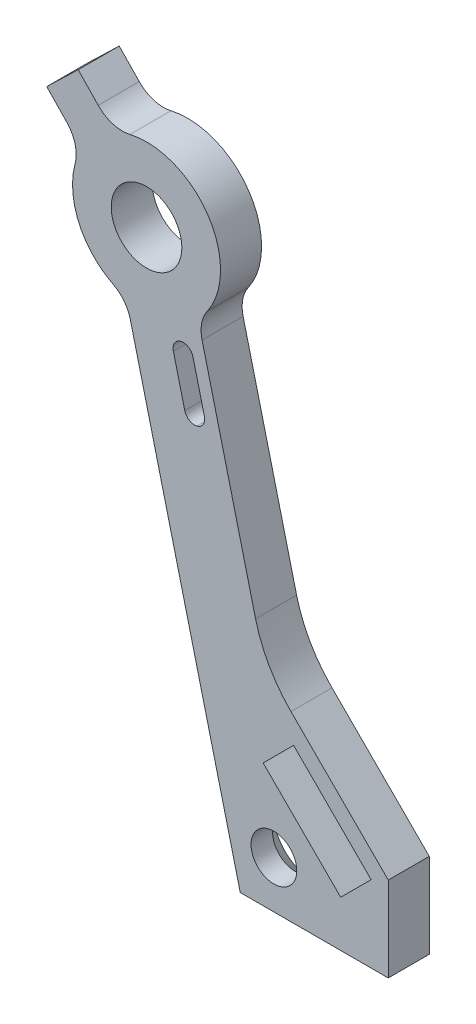
ISO-10303-21;
HEADER;
FILE_DESCRIPTION(('STEP AP214'),'2;1');
FILE_NAME('part.step','',(''),(''),'','','');
FILE_SCHEMA(('AUTOMOTIVE_DESIGN { 1 0 10303 214 1 1 1 1 }'));
ENDSEC;
DATA;
#1=APPLICATION_CONTEXT('core data for automotive mechanical design processes');
#2=APPLICATION_PROTOCOL_DEFINITION('international standard','automotive_design',2000,#1);
#3=PRODUCT_CONTEXT('',#1,'mechanical');
#4=PRODUCT('Part','Part','',(#3));
#5=PRODUCT_RELATED_PRODUCT_CATEGORY('part','',(#4));
#6=PRODUCT_DEFINITION_FORMATION('','',#4);
#7=PRODUCT_DEFINITION_CONTEXT('part definition',#1,'design');
#8=PRODUCT_DEFINITION('design','',#6,#7);
#9=PRODUCT_DEFINITION_SHAPE('','',#8);
#10=(LENGTH_UNIT() NAMED_UNIT(*) SI_UNIT(.MILLI.,.METRE.));
#11=(NAMED_UNIT(*) PLANE_ANGLE_UNIT() SI_UNIT($,.RADIAN.));
#12=(NAMED_UNIT(*) SI_UNIT($,.STERADIAN.) SOLID_ANGLE_UNIT());
#13=UNCERTAINTY_MEASURE_WITH_UNIT(LENGTH_MEASURE(1.E-05),#10,'distance_accuracy_value','');
#14=(GEOMETRIC_REPRESENTATION_CONTEXT(3) GLOBAL_UNCERTAINTY_ASSIGNED_CONTEXT((#13)) GLOBAL_UNIT_ASSIGNED_CONTEXT((#10,
#11,#12)) REPRESENTATION_CONTEXT('',''));
#15=CARTESIAN_POINT('',(0.,0.,0.));
#16=DIRECTION('',(0.,0.,1.));
#17=DIRECTION('',(1.,0.,0.));
#18=AXIS2_PLACEMENT_3D('',#15,#16,#17);
#19=CARTESIAN_POINT('',(4.36654034065617,1.08780763622181,-3.05));
#20=DIRECTION('',(-0.970342297923589,-0.241735030271512,0.));
#21=DIRECTION('',(0.241735030271512,-0.970342297923589,0.));
#22=AXIS2_PLACEMENT_3D('',#19,#20,#21);
#23=PLANE('',#22);
#24=DIRECTION('',(-0.241735030271512,0.970342297923589,0.));
#25=VECTOR('',#24,1.);
#26=CARTESIAN_POINT('',(4.36654034065617,1.08780763622181,0.));
#27=LINE('',#26,#25);
#28=CARTESIAN_POINT('',(-2.66788839228542,29.3245250604018,0.));
#29=VERTEX_POINT('',#28);
#30=CARTESIAN_POINT('',(-3.51396099823572,32.7207231031344,0.));
#31=VERTEX_POINT('',#30);
#32=EDGE_CURVE('E313',#29,#31,#27,.T.);
#33=ORIENTED_EDGE('',*,*,#32,.T.);
#34=DIRECTION('',(0.,0.,1.));
#35=VECTOR('',#34,1.);
#36=CARTESIAN_POINT('',(-3.51396099823572,32.7207231031344,0.));
#37=LINE('',#36,#35);
#38=CARTESIAN_POINT('',(-3.51396099823572,32.7207231031344,-3.05));
#39=VERTEX_POINT('',#38);
#40=EDGE_CURVE('E387',#39,#31,#37,.T.);
#41=ORIENTED_EDGE('',*,*,#40,.F.);
#42=DIRECTION('',(-0.241735030271512,0.970342297923589,0.));
#43=VECTOR('',#42,1.);
#44=CARTESIAN_POINT('',(4.36654034065617,1.08780763622181,-3.05));
#45=LINE('',#44,#43);
#46=CARTESIAN_POINT('',(-2.66788839228542,29.3245250604018,-3.05));
#47=VERTEX_POINT('',#46);
#48=EDGE_CURVE('E269',#47,#39,#45,.T.);
#49=ORIENTED_EDGE('',*,*,#48,.F.);
#50=DIRECTION('',(0.,0.,1.));
#51=VECTOR('',#50,1.);
#52=CARTESIAN_POINT('',(-2.66788839228542,29.3245250604018,-3.05));
#53=LINE('',#52,#51);
#54=EDGE_CURVE('E390',#29,#47,#53,.F.);
#55=ORIENTED_EDGE('',*,*,#54,.F.);
#56=EDGE_LOOP('',(#33,#41,#49,#55));
#57=FACE_BOUND('',#56,.T.);
#58=ADVANCED_FACE('F45',(#57),#23,.T.);
#59=CARTESIAN_POINT('',(7.70970869120796,7.70970869120796,-3.05));
#60=DIRECTION('',(0.707106781186548,0.707106781186547,0.));
#61=DIRECTION('',(-0.707106781186547,0.707106781186548,0.));
#62=AXIS2_PLACEMENT_3D('',#59,#60,#61);
#63=PLANE('',#62);
#64=DIRECTION('',(0.707106781186547,-0.707106781186548,0.));
#65=VECTOR('',#64,1.);
#66=CARTESIAN_POINT('',(7.70970869120796,7.70970869120796,0.));
#67=LINE('',#66,#65);
#68=CARTESIAN_POINT('',(3.96428752719385,11.4551298552221,0.));
#69=VERTEX_POINT('',#68);
#70=CARTESIAN_POINT('',(9.72720779386421,5.6922095885517,0.));
#71=VERTEX_POINT('',#70);
#72=EDGE_CURVE('E303',#69,#71,#67,.T.);
#73=ORIENTED_EDGE('',*,*,#72,.F.);
#74=DIRECTION('',(0.,0.,1.));
#75=VECTOR('',#74,1.);
#76=CARTESIAN_POINT('',(3.96428752719385,11.4551298552221,-3.05));
#77=LINE('',#76,#75);
#78=CARTESIAN_POINT('',(3.96428752719385,11.4551298552221,-3.05));
#79=VERTEX_POINT('',#78);
#80=EDGE_CURVE('E231',#79,#69,#77,.T.);
#81=ORIENTED_EDGE('',*,*,#80,.F.);
#82=DIRECTION('',(0.707106781186547,-0.707106781186548,0.));
#83=VECTOR('',#82,1.);
#84=CARTESIAN_POINT('',(7.70970869120796,7.70970869120796,-3.05));
#85=LINE('',#84,#83);
#86=CARTESIAN_POINT('',(9.72720779386421,5.6922095885517,-3.05));
#87=VERTEX_POINT('',#86);
#88=EDGE_CURVE('E259',#79,#87,#85,.T.);
#89=ORIENTED_EDGE('',*,*,#88,.T.);
#90=DIRECTION('',(0.,0.,1.));
#91=VECTOR('',#90,1.);
#92=CARTESIAN_POINT('',(9.72720779386421,5.6922095885517,-3.05));
#93=LINE('',#92,#91);
#94=EDGE_CURVE('E327',#87,#71,#93,.T.);
#95=ORIENTED_EDGE('',*,*,#94,.T.);
#96=EDGE_LOOP('',(#73,#81,#89,#95));
#97=FACE_BOUND('',#96,.T.);
#98=ADVANCED_FACE('F475',(#97),#63,.F.);
#99=CARTESIAN_POINT('',(2.01749910265625,-2.01749910265625,-3.05));
#100=DIRECTION('',(-0.707106781186547,0.707106781186548,0.));
#101=DIRECTION('',(-0.707106781186548,-0.707106781186547,0.));
#102=AXIS2_PLACEMENT_3D('',#99,#100,#101);
#103=PLANE('',#102);
#104=DIRECTION('',(0.707106781186548,0.707106781186547,0.));
#105=VECTOR('',#104,1.);
#106=CARTESIAN_POINT('',(2.01749910265625,-2.01749910265625,0.));
#107=LINE('',#106,#105);
#108=CARTESIAN_POINT('',(7.46446609406726,3.42946788875475,0.));
#109=VERTEX_POINT('',#108);
#110=EDGE_CURVE('E306',#109,#71,#107,.T.);
#111=ORIENTED_EDGE('',*,*,#110,.T.);
#112=ORIENTED_EDGE('',*,*,#94,.F.);
#113=DIRECTION('',(0.707106781186548,0.707106781186547,0.));
#114=VECTOR('',#113,1.);
#115=CARTESIAN_POINT('',(2.01749910265625,-2.01749910265625,-3.05));
#116=LINE('',#115,#114);
#117=CARTESIAN_POINT('',(7.46446609406726,3.42946788875475,-3.05));
#118=VERTEX_POINT('',#117);
#119=EDGE_CURVE('E262',#118,#87,#116,.T.);
#120=ORIENTED_EDGE('',*,*,#119,.F.);
#121=DIRECTION('',(0.,0.,1.));
#122=VECTOR('',#121,1.);
#123=CARTESIAN_POINT('',(7.46446609406726,3.42946788875475,-3.05));
#124=LINE('',#123,#122);
#125=EDGE_CURVE('E324',#118,#109,#124,.T.);
#126=ORIENTED_EDGE('',*,*,#125,.T.);
#127=EDGE_LOOP('',(#111,#112,#120,#126));
#128=FACE_BOUND('',#127,.T.);
#129=ADVANCED_FACE('F480',(#128),#103,.T.);
#130=CARTESIAN_POINT('',(5.44696699141101,5.44696699141101,-3.05));
#131=DIRECTION('',(-0.707106781186548,-0.707106781186548,0.));
#132=DIRECTION('',(0.707106781186548,-0.707106781186548,0.));
#133=AXIS2_PLACEMENT_3D('',#130,#131,#132);
#134=PLANE('',#133);
#135=DIRECTION('',(-0.707106781186548,0.707106781186548,0.));
#136=VECTOR('',#135,1.);
#137=CARTESIAN_POINT('',(5.44696699141101,5.44696699141101,0.));
#138=LINE('',#137,#136);
#139=CARTESIAN_POINT('',(1.70154582739689,9.19238815542512,0.));
#140=VERTEX_POINT('',#139);
#141=EDGE_CURVE('E308',#109,#140,#138,.T.);
#142=ORIENTED_EDGE('',*,*,#141,.F.);
#143=ORIENTED_EDGE('',*,*,#125,.F.);
#144=DIRECTION('',(-0.707106781186548,0.707106781186548,0.));
#145=VECTOR('',#144,1.);
#146=CARTESIAN_POINT('',(5.44696699141101,5.44696699141101,-3.05));
#147=LINE('',#146,#145);
#148=CARTESIAN_POINT('',(1.70154582739689,9.19238815542512,-3.05));
#149=VERTEX_POINT('',#148);
#150=EDGE_CURVE('E264',#118,#149,#147,.T.);
#151=ORIENTED_EDGE('',*,*,#150,.T.);
#152=DIRECTION('',(0.,0.,1.));
#153=VECTOR('',#152,1.);
#154=CARTESIAN_POINT('',(1.70154582739689,9.19238815542512,-3.05));
#155=LINE('',#154,#153);
#156=EDGE_CURVE('E321',#149,#140,#155,.T.);
#157=ORIENTED_EDGE('',*,*,#156,.T.);
#158=EDGE_LOOP('',(#142,#143,#151,#157));
#159=FACE_BOUND('',#158,.T.);
#160=ADVANCED_FACE('F489',(#159),#134,.F.);
#161=CARTESIAN_POINT('',(-6.96463898907044,39.3326684601052,-3.05));
#162=DIRECTION('',(0.,0.,1.));
#163=DIRECTION('',(-1.,0.,0.));
#164=AXIS2_PLACEMENT_3D('',#161,#162,#163);
#165=CYLINDRICAL_SURFACE('',#164,5.5);
#166=CARTESIAN_POINT('',(-6.96463898907044,39.3326684601052,0.));
#167=DIRECTION('',(0.,0.,1.));
#168=DIRECTION('',(1.,0.,0.));
#169=AXIS2_PLACEMENT_3D('',#166,#167,#168);
#170=CIRCLE('',#169,5.5);
#171=CARTESIAN_POINT('',(-2.45911194166731,36.1782705738013,0.));
#172=VERTEX_POINT('',#171);
#173=CARTESIAN_POINT('',(-8.19716703361366,44.6927873598513,0.));
#174=VERTEX_POINT('',#173);
#175=EDGE_CURVE('E279',#172,#174,#170,.T.);
#176=ORIENTED_EDGE('',*,*,#175,.F.);
#177=DIRECTION('',(0.,0.,1.));
#178=VECTOR('',#177,1.);
#179=CARTESIAN_POINT('',(-2.45911194166731,36.1782705738013,-3.05));
#180=LINE('',#179,#178);
#181=CARTESIAN_POINT('',(-2.45911194166731,36.1782705738013,-3.05));
#182=VERTEX_POINT('',#181);
#183=EDGE_CURVE('E340',#182,#172,#180,.T.);
#184=ORIENTED_EDGE('',*,*,#183,.F.);
#185=CARTESIAN_POINT('',(-6.96463898907044,39.3326684601052,-3.05));
#186=DIRECTION('',(0.,0.,1.));
#187=DIRECTION('',(1.,0.,0.));
#188=AXIS2_PLACEMENT_3D('',#185,#186,#187);
#189=CIRCLE('',#188,5.5);
#190=CARTESIAN_POINT('',(-8.19716703361366,44.6927873598513,-3.05));
#191=VERTEX_POINT('',#190);
#192=EDGE_CURVE('E238',#182,#191,#189,.T.);
#193=ORIENTED_EDGE('',*,*,#192,.T.);
#194=DIRECTION('',(0.,0.,1.));
#195=VECTOR('',#194,1.);
#196=CARTESIAN_POINT('',(-8.19716703361366,44.6927873598513,-3.05));
#197=LINE('',#196,#195);
#198=EDGE_CURVE('E343',#174,#191,#197,.F.);
#199=ORIENTED_EDGE('',*,*,#198,.F.);
#200=EDGE_LOOP('',(#176,#184,#193,#199));
#201=FACE_BOUND('',#200,.T.);
#202=ADVANCED_FACE('F492',(#201),#165,.T.);
#203=CARTESIAN_POINT('',(17.2180416361221,16.6208626165362,-3.05));
#204=DIRECTION('',(0.719473565232645,0.694519826161519,0.));
#205=DIRECTION('',(-0.694519826161519,0.719473565232645,0.));
#206=AXIS2_PLACEMENT_3D('',#203,#204,#205);
#207=PLANE('',#206);
#208=DIRECTION('',(0.694519826161519,-0.719473565232645,0.));
#209=VECTOR('',#208,1.);
#210=CARTESIAN_POINT('',(17.2180416361221,16.6208626165362,-3.05));
#211=LINE('',#210,#209);
#212=CARTESIAN_POINT('',(-12.0461728810211,46.9365252647115,-3.05));
#213=VERTEX_POINT('',#212);
#214=CARTESIAN_POINT('',(-10.5560909669422,45.3929054761502,-3.05));
#215=VERTEX_POINT('',#214);
#216=EDGE_CURVE('E216',#213,#215,#211,.T.);
#217=ORIENTED_EDGE('',*,*,#216,.F.);
#218=DIRECTION('',(0.,0.,1.));
#219=VECTOR('',#218,1.);
#220=CARTESIAN_POINT('',(-12.0461728810211,46.9365252647115,-3.05));
#221=LINE('',#220,#219);
#222=CARTESIAN_POINT('',(-12.0461728810211,46.9365252647115,0.));
#223=VERTEX_POINT('',#222);
#224=EDGE_CURVE('E224',#213,#223,#221,.T.);
#225=ORIENTED_EDGE('',*,*,#224,.T.);
#226=DIRECTION('',(0.694519826161519,-0.719473565232645,0.));
#227=VECTOR('',#226,1.);
#228=CARTESIAN_POINT('',(17.2180416361221,16.6208626165362,0.));
#229=LINE('',#228,#227);
#230=CARTESIAN_POINT('',(-10.5560909669422,45.3929054761502,0.));
#231=VERTEX_POINT('',#230);
#232=EDGE_CURVE('E286',#223,#231,#229,.T.);
#233=ORIENTED_EDGE('',*,*,#232,.T.);
#234=DIRECTION('',(0.,0.,1.));
#235=VECTOR('',#234,1.);
#236=CARTESIAN_POINT('',(-10.5560909669422,45.3929054761502,-3.05));
#237=LINE('',#236,#235);
#238=EDGE_CURVE('E237',#215,#231,#237,.T.);
#239=ORIENTED_EDGE('',*,*,#238,.F.);
#240=EDGE_LOOP('',(#217,#225,#233,#239));
#241=FACE_BOUND('',#240,.T.);
#242=ADVANCED_FACE('F235',(#241),#207,.T.);
#243=CARTESIAN_POINT('',(-29.2642145171432,30.3156626481751,-3.05));
#244=DIRECTION('',(-0.694519826161522,0.719473565232643,0.));
#245=DIRECTION('',(-0.719473565232643,-0.694519826161522,0.));
#246=AXIS2_PLACEMENT_3D('',#243,#244,#245);
#247=PLANE('',#246);
#248=DIRECTION('',(0.719473565232643,0.694519826161522,0.));
#249=VECTOR('',#248,1.);
#250=CARTESIAN_POINT('',(-29.2642145171432,30.3156626481751,0.));
#251=LINE('',#250,#249);
#252=CARTESIAN_POINT('',(-14.3844619680272,44.6793358296865,0.));
#253=VERTEX_POINT('',#252);
#254=EDGE_CURVE('E227',#253,#223,#251,.T.);
#255=ORIENTED_EDGE('',*,*,#254,.T.);
#256=ORIENTED_EDGE('',*,*,#224,.F.);
#257=DIRECTION('',(0.719473565232643,0.694519826161522,0.));
#258=VECTOR('',#257,1.);
#259=CARTESIAN_POINT('',(-29.2642145171432,30.3156626481751,-3.05));
#260=LINE('',#259,#258);
#261=CARTESIAN_POINT('',(-14.3844619680272,44.6793358296865,-3.05));
#262=VERTEX_POINT('',#261);
#263=EDGE_CURVE('E210',#262,#213,#260,.T.);
#264=ORIENTED_EDGE('',*,*,#263,.F.);
#265=DIRECTION('',(0.,0.,1.));
#266=VECTOR('',#265,1.);
#267=CARTESIAN_POINT('',(-14.3844619680272,44.6793358296865,-3.05));
#268=LINE('',#267,#266);
#269=EDGE_CURVE('E232',#262,#253,#268,.T.);
#270=ORIENTED_EDGE('',*,*,#269,.T.);
#271=EDGE_LOOP('',(#255,#256,#264,#270));
#272=FACE_BOUND('',#271,.T.);
#273=ADVANCED_FACE('F225',(#272),#247,.T.);
#274=CARTESIAN_POINT('',(14.8797525491159,14.3636731815112,-3.05));
#275=DIRECTION('',(0.719473565232646,0.694519826161518,0.));
#276=DIRECTION('',(-0.694519826161518,0.719473565232646,0.));
#277=AXIS2_PLACEMENT_3D('',#274,#275,#276);
#278=PLANE('',#277);
#279=DIRECTION('',(0.694519826161518,-0.719473565232647,0.));
#280=VECTOR('',#279,1.);
#281=CARTESIAN_POINT('',(14.8797525491159,14.3636731815112,0.));
#282=LINE('',#281,#280);
#283=CARTESIAN_POINT('',(-12.8943800539482,43.1357160411252,0.));
#284=VERTEX_POINT('',#283);
#285=EDGE_CURVE('E285',#253,#284,#282,.T.);
#286=ORIENTED_EDGE('',*,*,#285,.F.);
#287=ORIENTED_EDGE('',*,*,#269,.F.);
#288=DIRECTION('',(0.694519826161518,-0.719473565232647,0.));
#289=VECTOR('',#288,1.);
#290=CARTESIAN_POINT('',(14.8797525491159,14.3636731815112,-3.05));
#291=LINE('',#290,#289);
#292=CARTESIAN_POINT('',(-12.8943800539482,43.1357160411252,-3.05));
#293=VERTEX_POINT('',#292);
#294=EDGE_CURVE('E218',#262,#293,#291,.T.);
#295=ORIENTED_EDGE('',*,*,#294,.T.);
#296=DIRECTION('',(0.,0.,-1.));
#297=VECTOR('',#296,1.);
#298=CARTESIAN_POINT('',(-12.8943800539482,43.1357160411252,-3.05));
#299=LINE('',#298,#297);
#300=EDGE_CURVE('E352',#284,#293,#299,.T.);
#301=ORIENTED_EDGE('',*,*,#300,.F.);
#302=EDGE_LOOP('',(#286,#287,#295,#301));
#303=FACE_BOUND('',#302,.T.);
#304=ADVANCED_FACE('F518',(#303),#278,.F.);
#305=CARTESIAN_POINT('',(-12.2779311614175,40.7535577208413,-3.05));
#306=VERTEX_POINT('',#305);
#307=CARTESIAN_POINT('',(-9.4637704048032,34.4332458240289,-3.05));
#308=VERTEX_POINT('',#307);
#309=EDGE_CURVE('E243',#306,#308,#189,.T.);
#310=ORIENTED_EDGE('',*,*,#309,.T.);
#311=DIRECTION('',(0.,0.,1.));
#312=VECTOR('',#311,1.);
#313=CARTESIAN_POINT('',(-9.4637704048032,34.4332458240289,-3.05));
#314=LINE('',#313,#312);
#315=CARTESIAN_POINT('',(-9.4637704048032,34.4332458240289,0.));
#316=VERTEX_POINT('',#315);
#317=EDGE_CURVE('E346',#316,#308,#314,.F.);
#318=ORIENTED_EDGE('',*,*,#317,.F.);
#319=CARTESIAN_POINT('',(-12.2779311614175,40.7535577208413,0.));
#320=VERTEX_POINT('',#319);
#321=EDGE_CURVE('E281',#320,#316,#170,.T.);
#322=ORIENTED_EDGE('',*,*,#321,.F.);
#323=DIRECTION('',(0.,0.,1.));
#324=VECTOR('',#323,1.);
#325=CARTESIAN_POINT('',(-12.2779311614175,40.7535577208413,-3.05));
#326=LINE('',#325,#324);
#327=EDGE_CURVE('E349',#306,#320,#326,.T.);
#328=ORIENTED_EDGE('',*,*,#327,.F.);
#329=EDGE_LOOP('',(#310,#318,#322,#328));
#330=FACE_BOUND('',#329,.T.);
#331=ADVANCED_FACE('F514',(#330),#165,.T.);
#332=CARTESIAN_POINT('',(0.,0.,-3.05));
#333=DIRECTION('',(-0.970342297923589,-0.241735030271511,0.));
#334=DIRECTION('',(0.241735030271511,-0.970342297923589,0.));
#335=AXIS2_PLACEMENT_3D('',#332,#333,#334);
#336=PLANE('',#335);
#337=DIRECTION('',(-0.241735030271511,0.970342297923589,0.));
#338=VECTOR('',#337,1.);
#339=CARTESIAN_POINT('',(0.,0.,-3.05));
#340=LINE('',#339,#338);
#341=CARTESIAN_POINT('',(0.,0.,-3.05));
#342=VERTEX_POINT('',#341);
#343=CARTESIAN_POINT('',(-8.17388348532729,32.810573110582,-3.05));
#344=VERTEX_POINT('',#343);
#345=EDGE_CURVE('E247',#342,#344,#340,.T.);
#346=ORIENTED_EDGE('',*,*,#345,.F.);
#347=DIRECTION('',(0.,0.,1.));
#348=VECTOR('',#347,1.);
#349=CARTESIAN_POINT('',(0.,0.,-3.05));
#350=LINE('',#349,#348);
#351=CARTESIAN_POINT('',(0.,0.,0.));
#352=VERTEX_POINT('',#351);
#353=EDGE_CURVE('E335',#342,#352,#350,.T.);
#354=ORIENTED_EDGE('',*,*,#353,.T.);
#355=DIRECTION('',(-0.241735030271511,0.970342297923589,0.));
#356=VECTOR('',#355,1.);
#357=CARTESIAN_POINT('',(0.,0.,0.));
#358=LINE('',#357,#356);
#359=CARTESIAN_POINT('',(-8.17388348532729,32.810573110582,0.));
#360=VERTEX_POINT('',#359);
#361=EDGE_CURVE('E284',#352,#360,#358,.T.);
#362=ORIENTED_EDGE('',*,*,#361,.T.);
#363=DIRECTION('',(0.,0.,1.));
#364=VECTOR('',#363,1.);
#365=CARTESIAN_POINT('',(-8.17388348532729,32.810573110582,-3.05));
#366=LINE('',#365,#364);
#367=EDGE_CURVE('E355',#344,#360,#366,.T.);
#368=ORIENTED_EDGE('',*,*,#367,.F.);
#369=EDGE_LOOP('',(#346,#354,#362,#368));
#370=FACE_BOUND('',#369,.T.);
#371=ADVANCED_FACE('F510',(#370),#336,.T.);
#372=CARTESIAN_POINT('',(0.,0.,-3.05));
#373=DIRECTION('',(0.,1.,0.));
#374=DIRECTION('',(-1.,0.,0.));
#375=AXIS2_PLACEMENT_3D('',#372,#373,#374);
#376=PLANE('',#375);
#377=DIRECTION('',(1.,0.,0.));
#378=VECTOR('',#377,1.);
#379=CARTESIAN_POINT('',(0.,0.,0.));
#380=LINE('',#379,#378);
#381=CARTESIAN_POINT('',(11.,0.,0.));
#382=VERTEX_POINT('',#381);
#383=EDGE_CURVE('E293',#352,#382,#380,.T.);
#384=ORIENTED_EDGE('',*,*,#383,.F.);
#385=ORIENTED_EDGE('',*,*,#353,.F.);
#386=DIRECTION('',(1.,0.,0.));
#387=VECTOR('',#386,1.);
#388=CARTESIAN_POINT('',(0.,0.,-3.05));
#389=LINE('',#388,#387);
#390=CARTESIAN_POINT('',(11.,0.,-3.05));
#391=VERTEX_POINT('',#390);
#392=EDGE_CURVE('E250',#342,#391,#389,.T.);
#393=ORIENTED_EDGE('',*,*,#392,.T.);
#394=DIRECTION('',(0.,0.,1.));
#395=VECTOR('',#394,1.);
#396=CARTESIAN_POINT('',(11.,0.,-3.05));
#397=LINE('',#396,#395);
#398=EDGE_CURVE('E332',#391,#382,#397,.T.);
#399=ORIENTED_EDGE('',*,*,#398,.T.);
#400=EDGE_LOOP('',(#384,#385,#393,#399));
#401=FACE_BOUND('',#400,.T.);
#402=ADVANCED_FACE('F506',(#401),#376,.F.);
#403=CARTESIAN_POINT('',(11.,0.,-3.05));
#404=DIRECTION('',(1.,0.,0.));
#405=DIRECTION('',(0.,0.,1.));
#406=AXIS2_PLACEMENT_3D('',#403,#404,#405);
#407=PLANE('',#406);
#408=DIRECTION('',(0.,-1.,0.));
#409=VECTOR('',#408,1.);
#410=CARTESIAN_POINT('',(11.,0.,0.));
#411=LINE('',#410,#409);
#412=CARTESIAN_POINT('',(11.,6.30390861535611,0.));
#413=VERTEX_POINT('',#412);
#414=EDGE_CURVE('E296',#413,#382,#411,.T.);
#415=ORIENTED_EDGE('',*,*,#414,.T.);
#416=ORIENTED_EDGE('',*,*,#398,.F.);
#417=DIRECTION('',(0.,-1.,0.));
#418=VECTOR('',#417,1.);
#419=CARTESIAN_POINT('',(11.,0.,-3.05));
#420=LINE('',#419,#418);
#421=CARTESIAN_POINT('',(11.,6.30390861535611,-3.05));
#422=VERTEX_POINT('',#421);
#423=EDGE_CURVE('E253',#422,#391,#420,.T.);
#424=ORIENTED_EDGE('',*,*,#423,.F.);
#425=DIRECTION('',(0.,0.,1.));
#426=VECTOR('',#425,1.);
#427=CARTESIAN_POINT('',(11.,6.30390861535611,-3.05));
#428=LINE('',#427,#426);
#429=EDGE_CURVE('E275',#422,#413,#428,.T.);
#430=ORIENTED_EDGE('',*,*,#429,.T.);
#431=EDGE_LOOP('',(#415,#416,#424,#430));
#432=FACE_BOUND('',#431,.T.);
#433=ADVANCED_FACE('F502',(#432),#407,.T.);
#434=CARTESIAN_POINT('',(8.65195430767805,8.65195430767805,-3.05));
#435=DIRECTION('',(0.707106781186547,0.707106781186548,0.));
#436=DIRECTION('',(-0.707106781186548,0.707106781186547,0.));
#437=AXIS2_PLACEMENT_3D('',#434,#435,#436);
#438=PLANE('',#437);
#439=DIRECTION('',(0.707106781186548,-0.707106781186547,0.));
#440=VECTOR('',#439,1.);
#441=CARTESIAN_POINT('',(8.65195430767805,8.65195430767805,0.));
#442=LINE('',#441,#440);
#443=CARTESIAN_POINT('',(3.76932576449459,13.5345828508615,0.));
#444=VERTEX_POINT('',#443);
#445=EDGE_CURVE('E298',#444,#413,#442,.T.);
#446=ORIENTED_EDGE('',*,*,#445,.T.);
#447=ORIENTED_EDGE('',*,*,#429,.F.);
#448=DIRECTION('',(0.707106781186548,-0.707106781186547,0.));
#449=VECTOR('',#448,1.);
#450=CARTESIAN_POINT('',(8.65195430767805,8.65195430767805,-3.05));
#451=LINE('',#450,#449);
#452=CARTESIAN_POINT('',(3.76932576449459,13.5345828508615,-3.05));
#453=VERTEX_POINT('',#452);
#454=EDGE_CURVE('E255',#453,#422,#451,.T.);
#455=ORIENTED_EDGE('',*,*,#454,.F.);
#456=DIRECTION('',(0.,0.,1.));
#457=VECTOR('',#456,1.);
#458=CARTESIAN_POINT('',(3.76932576449459,13.5345828508615,-3.05));
#459=LINE('',#458,#457);
#460=EDGE_CURVE('E380',#444,#453,#459,.F.);
#461=ORIENTED_EDGE('',*,*,#460,.F.);
#462=EDGE_LOOP('',(#446,#447,#455,#461));
#463=FACE_BOUND('',#462,.T.);
#464=ADVANCED_FACE('F487',(#463),#438,.T.);
#465=CARTESIAN_POINT('',(-3.74542116401411,3.74542116401412,-3.05));
#466=DIRECTION('',(-0.707106781186547,0.707106781186548,0.));
#467=DIRECTION('',(-0.707106781186548,-0.707106781186547,0.));
#468=AXIS2_PLACEMENT_3D('',#465,#466,#467);
#469=PLANE('',#468);
#470=DIRECTION('',(0.707106781186548,0.707106781186547,0.));
#471=VECTOR('',#470,1.);
#472=CARTESIAN_POINT('',(-3.74542116401411,3.74542116401412,0.));
#473=LINE('',#472,#471);
#474=EDGE_CURVE('E311',#140,#69,#473,.T.);
#475=ORIENTED_EDGE('',*,*,#474,.F.);
#476=ORIENTED_EDGE('',*,*,#156,.F.);
#477=DIRECTION('',(0.707106781186548,0.707106781186547,0.));
#478=VECTOR('',#477,1.);
#479=CARTESIAN_POINT('',(-3.74542116401411,3.74542116401412,-3.05));
#480=LINE('',#479,#478);
#481=EDGE_CURVE('E267',#149,#79,#480,.T.);
#482=ORIENTED_EDGE('',*,*,#481,.T.);
#483=ORIENTED_EDGE('',*,*,#80,.T.);
#484=EDGE_LOOP('',(#475,#476,#482,#483));
#485=FACE_BOUND('',#484,.T.);
#486=ADVANCED_FACE('F484',(#485),#469,.F.);
#487=CARTESIAN_POINT('',(5.33688263857945,1.32954266649319,-3.05));
#488=DIRECTION('',(0.970342297923591,0.241735030271503,0.));
#489=DIRECTION('',(-0.241735030271503,0.970342297923591,0.));
#490=AXIS2_PLACEMENT_3D('',#487,#488,#489);
#491=PLANE('',#490);
#492=DIRECTION('',(0.241735030271503,-0.970342297923591,0.));
#493=VECTOR('',#492,1.);
#494=CARTESIAN_POINT('',(5.33688263857945,1.32954266649319,-3.05));
#495=LINE('',#494,#493);
#496=CARTESIAN_POINT('',(-2.8370008467476,34.1401157770753,-3.05));
#497=VERTEX_POINT('',#496);
#498=CARTESIAN_POINT('',(1.13697059712415,18.188300360012,-3.05));
#499=VERTEX_POINT('',#498);
#500=EDGE_CURVE('E257',#497,#499,#495,.T.);
#501=ORIENTED_EDGE('',*,*,#500,.F.);
#502=DIRECTION('',(0.,0.,1.));
#503=VECTOR('',#502,1.);
#504=CARTESIAN_POINT('',(-2.83700084674759,34.1401157770753,-3.05));
#505=LINE('',#504,#503);
#506=CARTESIAN_POINT('',(-2.8370008467476,34.1401157770753,0.));
#507=VERTEX_POINT('',#506);
#508=EDGE_CURVE('E358',#507,#497,#505,.F.);
#509=ORIENTED_EDGE('',*,*,#508,.F.);
#510=DIRECTION('',(0.241735030271503,-0.970342297923591,0.));
#511=VECTOR('',#510,1.);
#512=CARTESIAN_POINT('',(5.33688263857945,1.32954266649319,0.));
#513=LINE('',#512,#511);
#514=CARTESIAN_POINT('',(1.13697059712415,18.188300360012,0.));
#515=VERTEX_POINT('',#514);
#516=EDGE_CURVE('E300',#507,#515,#513,.T.);
#517=ORIENTED_EDGE('',*,*,#516,.T.);
#518=DIRECTION('',(0.,0.,1.));
#519=VECTOR('',#518,1.);
#520=CARTESIAN_POINT('',(1.13697059712415,18.188300360012,0.));
#521=LINE('',#520,#519);
#522=EDGE_CURVE('E377',#499,#515,#521,.T.);
#523=ORIENTED_EDGE('',*,*,#522,.F.);
#524=EDGE_LOOP('',(#501,#509,#517,#523));
#525=FACE_BOUND('',#524,.T.);
#526=ADVANCED_FACE('F433',(#525),#491,.T.);
#527=CARTESIAN_POINT('',(-6.96463898907044,39.3326684601052,-3.05));
#528=DIRECTION('',(0.,0.,1.));
#529=DIRECTION('',(-1.,0.,0.));
#530=AXIS2_PLACEMENT_3D('',#527,#528,#529);
#531=CYLINDRICAL_SURFACE('',#530,2.625);
#532=CARTESIAN_POINT('',(-6.96463898907044,39.3326684601052,-3.05));
#533=DIRECTION('',(0.,0.,1.));
#534=DIRECTION('',(1.,0.,0.));
#535=AXIS2_PLACEMENT_3D('',#532,#533,#534);
#536=CIRCLE('',#535,2.625);
#537=CARTESIAN_POINT('',(-4.33963898907044,39.3326684601052,-3.05));
#538=VERTEX_POINT('',#537);
#539=EDGE_CURVE('E241',#538,#538,#536,.T.);
#540=ORIENTED_EDGE('',*,*,#539,.F.);
#541=EDGE_LOOP('',(#540));
#542=FACE_BOUND('',#541,.T.);
#543=CARTESIAN_POINT('',(-6.96463898907044,39.3326684601052,0.));
#544=DIRECTION('',(0.,0.,1.));
#545=DIRECTION('',(1.,0.,0.));
#546=AXIS2_PLACEMENT_3D('',#543,#544,#545);
#547=CIRCLE('',#546,2.625);
#548=CARTESIAN_POINT('',(-4.33963898907044,39.3326684601052,0.));
#549=VERTEX_POINT('',#548);
#550=EDGE_CURVE('E276',#549,#549,#547,.T.);
#551=ORIENTED_EDGE('',*,*,#550,.T.);
#552=EDGE_LOOP('',(#551));
#553=FACE_BOUND('',#552,.T.);
#554=ADVANCED_FACE('F429',(#542,#553),#531,.F.);
#555=CARTESIAN_POINT('',(2.91102689377077,0.725205090814533,-3.05));
#556=DIRECTION('',(0.970342297923589,0.241735030271511,0.));
#557=DIRECTION('',(-0.241735030271511,0.970342297923589,0.));
#558=AXIS2_PLACEMENT_3D('',#555,#556,#557);
#559=PLANE('',#558);
#560=DIRECTION('',(0.241735030271511,-0.970342297923589,0.));
#561=VECTOR('',#560,1.);
#562=CARTESIAN_POINT('',(2.91102689377077,0.725205090814533,-3.05));
#563=LINE('',#562,#561);
#564=CARTESIAN_POINT('',(-4.9694744451211,32.3581205577271,-3.05));
#565=VERTEX_POINT('',#564);
#566=CARTESIAN_POINT('',(-4.12340183917081,28.9619225149945,-3.05));
#567=VERTEX_POINT('',#566);
#568=EDGE_CURVE('E272',#565,#567,#563,.T.);
#569=ORIENTED_EDGE('',*,*,#568,.F.);
#570=DIRECTION('',(0.,0.,1.));
#571=VECTOR('',#570,1.);
#572=CARTESIAN_POINT('',(-4.9694744451211,32.3581205577271,-3.05));
#573=LINE('',#572,#571);
#574=CARTESIAN_POINT('',(-4.9694744451211,32.3581205577271,0.));
#575=VERTEX_POINT('',#574);
#576=EDGE_CURVE('E393',#575,#565,#573,.F.);
#577=ORIENTED_EDGE('',*,*,#576,.F.);
#578=DIRECTION('',(0.241735030271511,-0.970342297923589,0.));
#579=VECTOR('',#578,1.);
#580=CARTESIAN_POINT('',(2.91102689377077,0.725205090814533,0.));
#581=LINE('',#580,#579);
#582=CARTESIAN_POINT('',(-4.12340183917081,28.9619225149945,0.));
#583=VERTEX_POINT('',#582);
#584=EDGE_CURVE('E316',#575,#583,#581,.T.);
#585=ORIENTED_EDGE('',*,*,#584,.T.);
#586=DIRECTION('',(0.,0.,1.));
#587=VECTOR('',#586,1.);
#588=CARTESIAN_POINT('',(-4.12340183917081,28.9619225149945,0.));
#589=LINE('',#588,#587);
#590=EDGE_CURVE('E396',#567,#583,#589,.T.);
#591=ORIENTED_EDGE('',*,*,#590,.F.);
#592=EDGE_LOOP('',(#569,#577,#585,#591));
#593=FACE_BOUND('',#592,.T.);
#594=ADVANCED_FACE('F432',(#593),#559,.T.);
#595=CARTESIAN_POINT('',(0.,0.,-3.05));
#596=DIRECTION('',(0.,0.,-1.));
#597=DIRECTION('',(1.,0.,0.));
#598=AXIS2_PLACEMENT_3D('',#595,#596,#597);
#599=PLANE('',#598);
#600=CARTESIAN_POINT('',(2.5,3.5,-3.05));
#601=DIRECTION('',(0.,0.,1.));
#602=DIRECTION('',(1.,0.,0.));
#603=AXIS2_PLACEMENT_3D('',#600,#601,#602);
#604=CIRCLE('',#603,3.15);
#605=CARTESIAN_POINT('',(5.65,3.5,-3.05));
#606=VERTEX_POINT('',#605);
#607=EDGE_CURVE('E414',#606,#606,#604,.T.);
#608=ORIENTED_EDGE('',*,*,#607,.T.);
#609=EDGE_LOOP('',(#608));
#610=FACE_BOUND('',#609,.T.);
#611=ORIENTED_EDGE('',*,*,#539,.T.);
#612=EDGE_LOOP('',(#611));
#613=FACE_BOUND('',#612,.T.);
#614=ORIENTED_EDGE('',*,*,#500,.T.);
#615=CARTESIAN_POINT('',(10.8403935763601,20.605650662727,-3.05));
#616=DIRECTION('',(0.,0.,1.));
#617=DIRECTION('',(1.,0.,0.));
#618=AXIS2_PLACEMENT_3D('',#615,#616,#617);
#619=CIRCLE('',#618,10.);
#620=EDGE_CURVE('E385',#453,#499,#619,.F.);
#621=ORIENTED_EDGE('',*,*,#620,.F.);
#622=ORIENTED_EDGE('',*,*,#454,.T.);
#623=ORIENTED_EDGE('',*,*,#423,.T.);
#624=ORIENTED_EDGE('',*,*,#392,.F.);
#625=ORIENTED_EDGE('',*,*,#345,.T.);
#626=CARTESIAN_POINT('',(-10.5997392301363,32.2062355349032,-3.05));
#627=DIRECTION('',(0.,0.,1.));
#628=DIRECTION('',(1.,0.,0.));
#629=AXIS2_PLACEMENT_3D('',#626,#627,#628);
#630=CIRCLE('',#629,2.5);
#631=EDGE_CURVE('E371',#308,#344,#630,.F.);
#632=ORIENTED_EDGE('',*,*,#631,.F.);
#633=ORIENTED_EDGE('',*,*,#309,.F.);
#634=CARTESIAN_POINT('',(-14.6930639670298,41.3994164757214,-3.05));
#635=DIRECTION('',(0.,0.,1.));
#636=DIRECTION('',(1.,0.,0.));
#637=AXIS2_PLACEMENT_3D('',#634,#635,#636);
#638=CIRCLE('',#637,2.5);
#639=EDGE_CURVE('E367',#293,#306,#638,.F.);
#640=ORIENTED_EDGE('',*,*,#639,.F.);
#641=ORIENTED_EDGE('',*,*,#294,.F.);
#642=ORIENTED_EDGE('',*,*,#263,.T.);
#643=ORIENTED_EDGE('',*,*,#216,.T.);
#644=CARTESIAN_POINT('',(-8.75740705386057,47.129205041554,-3.05));
#645=DIRECTION('',(0.,0.,1.));
#646=DIRECTION('',(1.,0.,0.));
#647=AXIS2_PLACEMENT_3D('',#644,#645,#646);
#648=CIRCLE('',#647,2.5);
#649=EDGE_CURVE('E363',#191,#215,#648,.F.);
#650=ORIENTED_EDGE('',*,*,#649,.F.);
#651=ORIENTED_EDGE('',*,*,#192,.F.);
#652=CARTESIAN_POINT('',(-0.411145101938617,34.7444533527541,-3.05));
#653=DIRECTION('',(0.,0.,1.));
#654=DIRECTION('',(1.,0.,0.));
#655=AXIS2_PLACEMENT_3D('',#652,#653,#654);
#656=CIRCLE('',#655,2.5);
#657=EDGE_CURVE('E375',#497,#182,#656,.F.);
#658=ORIENTED_EDGE('',*,*,#657,.F.);
#659=EDGE_LOOP('',(#614,#621,#622,#623,#624,#625,#632,#633,#640,#641,#642,#643,#650,#651,#658));
#660=FACE_BOUND('',#659,.T.);
#661=ORIENTED_EDGE('',*,*,#88,.F.);
#662=ORIENTED_EDGE('',*,*,#481,.F.);
#663=ORIENTED_EDGE('',*,*,#150,.F.);
#664=ORIENTED_EDGE('',*,*,#119,.T.);
#665=EDGE_LOOP('',(#661,#662,#663,#664));
#666=FACE_BOUND('',#665,.T.);
#667=ORIENTED_EDGE('',*,*,#568,.T.);
#668=CARTESIAN_POINT('',(-3.39564511572811,29.1432237876982,-3.05));
#669=DIRECTION('',(0.,0.,1.));
#670=DIRECTION('',(1.,0.,0.));
#671=AXIS2_PLACEMENT_3D('',#668,#669,#670);
#672=CIRCLE('',#671,0.75);
#673=CARTESIAN_POINT('',(-3.21434384302448,28.4154670642555,-3.05));
#674=VERTEX_POINT('',#673);
#675=EDGE_CURVE('E407',#674,#567,#672,.F.);
#676=ORIENTED_EDGE('',*,*,#675,.F.);
#677=CARTESIAN_POINT('',(-3.39564511572811,29.1432237876982,-3.05));
#678=DIRECTION('',(0.,0.,1.));
#679=DIRECTION('',(1.,0.,0.));
#680=AXIS2_PLACEMENT_3D('',#677,#678,#679);
#681=CIRCLE('',#680,0.75);
#682=EDGE_CURVE('E401',#47,#674,#681,.F.);
#683=ORIENTED_EDGE('',*,*,#682,.F.);
#684=ORIENTED_EDGE('',*,*,#48,.T.);
#685=CARTESIAN_POINT('',(-4.24171772167841,32.5394218304307,-3.05));
#686=DIRECTION('',(0.,0.,1.));
#687=DIRECTION('',(1.,0.,0.));
#688=AXIS2_PLACEMENT_3D('',#685,#686,#687);
#689=CIRCLE('',#688,0.75);
#690=CARTESIAN_POINT('',(-4.42301899438203,33.2671785538734,-3.05));
#691=VERTEX_POINT('',#690);
#692=EDGE_CURVE('E411',#691,#39,#689,.F.);
#693=ORIENTED_EDGE('',*,*,#692,.F.);
#694=CARTESIAN_POINT('',(-4.24171772167841,32.5394218304307,-3.05));
#695=DIRECTION('',(0.,0.,1.));
#696=DIRECTION('',(1.,0.,0.));
#697=AXIS2_PLACEMENT_3D('',#694,#695,#696);
#698=CIRCLE('',#697,0.75);
#699=EDGE_CURVE('E11',#565,#691,#698,.F.);
#700=ORIENTED_EDGE('',*,*,#699,.F.);
#701=EDGE_LOOP('',(#667,#676,#683,#684,#693,#700));
#702=FACE_BOUND('',#701,.T.);
#703=ADVANCED_FACE('F213',(#610,#613,#660,#666,#702),#599,.T.);
#704=CARTESIAN_POINT('',(0.,0.,0.));
#705=DIRECTION('',(0.,0.,-1.));
#706=DIRECTION('',(1.,0.,0.));
#707=AXIS2_PLACEMENT_3D('',#704,#705,#706);
#708=PLANE('',#707);
#709=CARTESIAN_POINT('',(2.5,3.5,0.));
#710=DIRECTION('',(0.,0.,1.));
#711=DIRECTION('',(1.,0.,0.));
#712=AXIS2_PLACEMENT_3D('',#709,#710,#711);
#713=CIRCLE('',#712,1.7);
#714=CARTESIAN_POINT('',(4.2,3.5,0.));
#715=VERTEX_POINT('',#714);
#716=EDGE_CURVE('E280',#715,#715,#713,.T.);
#717=ORIENTED_EDGE('',*,*,#716,.F.);
#718=EDGE_LOOP('',(#717));
#719=FACE_BOUND('',#718,.T.);
#720=ORIENTED_EDGE('',*,*,#550,.F.);
#721=EDGE_LOOP('',(#720));
#722=FACE_BOUND('',#721,.T.);
#723=ORIENTED_EDGE('',*,*,#175,.T.);
#724=CARTESIAN_POINT('',(-8.75740705386057,47.129205041554,0.));
#725=DIRECTION('',(0.,0.,1.));
#726=DIRECTION('',(1.,0.,0.));
#727=AXIS2_PLACEMENT_3D('',#724,#725,#726);
#728=CIRCLE('',#727,2.5);
#729=EDGE_CURVE('E361',#231,#174,#728,.T.);
#730=ORIENTED_EDGE('',*,*,#729,.F.);
#731=ORIENTED_EDGE('',*,*,#232,.F.);
#732=ORIENTED_EDGE('',*,*,#254,.F.);
#733=ORIENTED_EDGE('',*,*,#285,.T.);
#734=CARTESIAN_POINT('',(-14.6930639670298,41.3994164757214,0.));
#735=DIRECTION('',(0.,0.,1.));
#736=DIRECTION('',(1.,0.,0.));
#737=AXIS2_PLACEMENT_3D('',#734,#735,#736);
#738=CIRCLE('',#737,2.5);
#739=EDGE_CURVE('E365',#320,#284,#738,.T.);
#740=ORIENTED_EDGE('',*,*,#739,.F.);
#741=ORIENTED_EDGE('',*,*,#321,.T.);
#742=CARTESIAN_POINT('',(-10.5997392301363,32.2062355349032,0.));
#743=DIRECTION('',(0.,0.,1.));
#744=DIRECTION('',(1.,0.,0.));
#745=AXIS2_PLACEMENT_3D('',#742,#743,#744);
#746=CIRCLE('',#745,2.5);
#747=EDGE_CURVE('E369',#360,#316,#746,.T.);
#748=ORIENTED_EDGE('',*,*,#747,.F.);
#749=ORIENTED_EDGE('',*,*,#361,.F.);
#750=ORIENTED_EDGE('',*,*,#383,.T.);
#751=ORIENTED_EDGE('',*,*,#414,.F.);
#752=ORIENTED_EDGE('',*,*,#445,.F.);
#753=CARTESIAN_POINT('',(10.8403935763601,20.605650662727,0.));
#754=DIRECTION('',(0.,0.,1.));
#755=DIRECTION('',(1.,0.,0.));
#756=AXIS2_PLACEMENT_3D('',#753,#754,#755);
#757=CIRCLE('',#756,10.);
#758=EDGE_CURVE('E383',#515,#444,#757,.T.);
#759=ORIENTED_EDGE('',*,*,#758,.F.);
#760=ORIENTED_EDGE('',*,*,#516,.F.);
#761=CARTESIAN_POINT('',(-0.411145101938617,34.7444533527541,0.));
#762=DIRECTION('',(0.,0.,1.));
#763=DIRECTION('',(1.,0.,0.));
#764=AXIS2_PLACEMENT_3D('',#761,#762,#763);
#765=CIRCLE('',#764,2.5);
#766=EDGE_CURVE('E373',#172,#507,#765,.T.);
#767=ORIENTED_EDGE('',*,*,#766,.F.);
#768=EDGE_LOOP('',(#723,#730,#731,#732,#733,#740,#741,#748,#749,#750,#751,#752,#759,#760,#767));
#769=FACE_BOUND('',#768,.T.);
#770=ORIENTED_EDGE('',*,*,#72,.T.);
#771=ORIENTED_EDGE('',*,*,#110,.F.);
#772=ORIENTED_EDGE('',*,*,#141,.T.);
#773=ORIENTED_EDGE('',*,*,#474,.T.);
#774=EDGE_LOOP('',(#770,#771,#772,#773));
#775=FACE_BOUND('',#774,.T.);
#776=CARTESIAN_POINT('',(-4.24171772167841,32.5394218304307,0.));
#777=DIRECTION('',(0.,0.,1.));
#778=DIRECTION('',(1.,0.,0.));
#779=AXIS2_PLACEMENT_3D('',#776,#777,#778);
#780=CIRCLE('',#779,0.75);
#781=CARTESIAN_POINT('',(-4.42301899438203,33.2671785538734,0.));
#782=VERTEX_POINT('',#781);
#783=EDGE_CURVE('E409',#31,#782,#780,.T.);
#784=ORIENTED_EDGE('',*,*,#783,.F.);
#785=ORIENTED_EDGE('',*,*,#32,.F.);
#786=CARTESIAN_POINT('',(-3.39564511572811,29.1432237876982,0.));
#787=DIRECTION('',(0.,0.,1.));
#788=DIRECTION('',(1.,0.,0.));
#789=AXIS2_PLACEMENT_3D('',#786,#787,#788);
#790=CIRCLE('',#789,0.75);
#791=CARTESIAN_POINT('',(-3.21434384302448,28.4154670642555,0.));
#792=VERTEX_POINT('',#791);
#793=EDGE_CURVE('E399',#792,#29,#790,.T.);
#794=ORIENTED_EDGE('',*,*,#793,.F.);
#795=CARTESIAN_POINT('',(-3.39564511572811,29.1432237876982,0.));
#796=DIRECTION('',(0.,0.,1.));
#797=DIRECTION('',(1.,0.,0.));
#798=AXIS2_PLACEMENT_3D('',#795,#796,#797);
#799=CIRCLE('',#798,0.75);
#800=EDGE_CURVE('E404',#583,#792,#799,.T.);
#801=ORIENTED_EDGE('',*,*,#800,.F.);
#802=ORIENTED_EDGE('',*,*,#584,.F.);
#803=CARTESIAN_POINT('',(-4.24171772167841,32.5394218304307,0.));
#804=DIRECTION('',(0.,0.,1.));
#805=DIRECTION('',(1.,0.,0.));
#806=AXIS2_PLACEMENT_3D('',#803,#804,#805);
#807=CIRCLE('',#806,0.75);
#808=EDGE_CURVE('E54',#782,#575,#807,.T.);
#809=ORIENTED_EDGE('',*,*,#808,.F.);
#810=EDGE_LOOP('',(#784,#785,#794,#801,#802,#809));
#811=FACE_BOUND('',#810,.T.);
#812=ADVANCED_FACE('F437',(#719,#722,#769,#775,#811),#708,.F.);
#813=CARTESIAN_POINT('',(2.5,3.5,-3.05));
#814=DIRECTION('',(0.,0.,-1.));
#815=DIRECTION('',(1.,0.,0.));
#816=AXIS2_PLACEMENT_3D('',#813,#814,#815);
#817=CYLINDRICAL_SURFACE('',#816,1.7);
#818=ORIENTED_EDGE('',*,*,#716,.T.);
#819=EDGE_LOOP('',(#818));
#820=FACE_BOUND('',#819,.T.);
#821=CARTESIAN_POINT('',(2.5,3.5,-1.6));
#822=DIRECTION('',(0.,0.,1.));
#823=DIRECTION('',(1.,0.,0.));
#824=AXIS2_PLACEMENT_3D('',#821,#822,#823);
#825=CIRCLE('',#824,1.7);
#826=CARTESIAN_POINT('',(4.2,3.5,-1.6));
#827=VERTEX_POINT('',#826);
#828=EDGE_CURVE('E417',#827,#827,#825,.T.);
#829=ORIENTED_EDGE('',*,*,#828,.F.);
#830=EDGE_LOOP('',(#829));
#831=FACE_BOUND('',#830,.T.);
#832=ADVANCED_FACE('F440',(#820,#831),#817,.F.);
#833=CARTESIAN_POINT('',(2.5,3.5,-3.05));
#834=DIRECTION('',(0.,0.,-1.));
#835=DIRECTION('',(1.,0.,0.));
#836=AXIS2_PLACEMENT_3D('',#833,#834,#835);
#837=CONICAL_SURFACE('',#836,3.15,0.785398163397448);
#838=ORIENTED_EDGE('',*,*,#828,.T.);
#839=EDGE_LOOP('',(#838));
#840=FACE_BOUND('',#839,.T.);
#841=ORIENTED_EDGE('',*,*,#607,.F.);
#842=EDGE_LOOP('',(#841));
#843=FACE_BOUND('',#842,.T.);
#844=ADVANCED_FACE('F531',(#840,#843),#837,.F.);
#845=CARTESIAN_POINT('',(-8.75740705386057,47.129205041554,-3.05));
#846=DIRECTION('',(0.,0.,1.));
#847=DIRECTION('',(-1.,0.,0.));
#848=AXIS2_PLACEMENT_3D('',#845,#846,#847);
#849=CYLINDRICAL_SURFACE('',#848,2.5);
#850=ORIENTED_EDGE('',*,*,#649,.T.);
#851=ORIENTED_EDGE('',*,*,#238,.T.);
#852=ORIENTED_EDGE('',*,*,#729,.T.);
#853=ORIENTED_EDGE('',*,*,#198,.T.);
#854=EDGE_LOOP('',(#850,#851,#852,#853));
#855=FACE_BOUND('',#854,.T.);
#856=ADVANCED_FACE('F527',(#855),#849,.F.);
#857=CARTESIAN_POINT('',(-14.6930639670298,41.3994164757214,-3.05));
#858=DIRECTION('',(0.,0.,1.));
#859=DIRECTION('',(-1.,0.,0.));
#860=AXIS2_PLACEMENT_3D('',#857,#858,#859);
#861=CYLINDRICAL_SURFACE('',#860,2.5);
#862=ORIENTED_EDGE('',*,*,#639,.T.);
#863=ORIENTED_EDGE('',*,*,#327,.T.);
#864=ORIENTED_EDGE('',*,*,#739,.T.);
#865=ORIENTED_EDGE('',*,*,#300,.T.);
#866=EDGE_LOOP('',(#862,#863,#864,#865));
#867=FACE_BOUND('',#866,.T.);
#868=ADVANCED_FACE('F530',(#867),#861,.F.);
#869=CARTESIAN_POINT('',(-10.5997392301363,32.2062355349032,-3.05));
#870=DIRECTION('',(0.,0.,1.));
#871=DIRECTION('',(-1.,0.,0.));
#872=AXIS2_PLACEMENT_3D('',#869,#870,#871);
#873=CYLINDRICAL_SURFACE('',#872,2.5);
#874=ORIENTED_EDGE('',*,*,#631,.T.);
#875=ORIENTED_EDGE('',*,*,#367,.T.);
#876=ORIENTED_EDGE('',*,*,#747,.T.);
#877=ORIENTED_EDGE('',*,*,#317,.T.);
#878=EDGE_LOOP('',(#874,#875,#876,#877));
#879=FACE_BOUND('',#878,.T.);
#880=ADVANCED_FACE('F535',(#879),#873,.F.);
#881=CARTESIAN_POINT('',(-0.411145101938617,34.7444533527541,-3.05));
#882=DIRECTION('',(0.,0.,1.));
#883=DIRECTION('',(-1.,0.,0.));
#884=AXIS2_PLACEMENT_3D('',#881,#882,#883);
#885=CYLINDRICAL_SURFACE('',#884,2.5);
#886=ORIENTED_EDGE('',*,*,#657,.T.);
#887=ORIENTED_EDGE('',*,*,#183,.T.);
#888=ORIENTED_EDGE('',*,*,#766,.T.);
#889=ORIENTED_EDGE('',*,*,#508,.T.);
#890=EDGE_LOOP('',(#886,#887,#888,#889));
#891=FACE_BOUND('',#890,.T.);
#892=ADVANCED_FACE('F539',(#891),#885,.F.);
#893=CARTESIAN_POINT('',(10.8403935763601,20.605650662727,-3.05));
#894=DIRECTION('',(0.,0.,-1.));
#895=DIRECTION('',(1.,0.,0.));
#896=AXIS2_PLACEMENT_3D('',#893,#894,#895);
#897=CYLINDRICAL_SURFACE('',#896,10.);
#898=ORIENTED_EDGE('',*,*,#620,.T.);
#899=ORIENTED_EDGE('',*,*,#522,.T.);
#900=ORIENTED_EDGE('',*,*,#758,.T.);
#901=ORIENTED_EDGE('',*,*,#460,.T.);
#902=EDGE_LOOP('',(#898,#899,#900,#901));
#903=FACE_BOUND('',#902,.T.);
#904=ADVANCED_FACE('F543',(#903),#897,.F.);
#905=CARTESIAN_POINT('',(-3.39564511572811,29.1432237876982,-3.05));
#906=DIRECTION('',(0.,0.,-1.));
#907=DIRECTION('',(1.,0.,0.));
#908=AXIS2_PLACEMENT_3D('',#905,#906,#907);
#909=CYLINDRICAL_SURFACE('',#908,0.75);
#910=ORIENTED_EDGE('',*,*,#590,.T.);
#911=ORIENTED_EDGE('',*,*,#800,.T.);
#912=DIRECTION('',(0.,0.,1.));
#913=VECTOR('',#912,1.);
#914=CARTESIAN_POINT('',(-3.21434384302449,28.4154670642555,-3.05));
#915=LINE('',#914,#913);
#916=EDGE_CURVE('E413',#792,#674,#915,.F.);
#917=ORIENTED_EDGE('',*,*,#916,.T.);
#918=ORIENTED_EDGE('',*,*,#675,.T.);
#919=EDGE_LOOP('',(#910,#911,#917,#918));
#920=FACE_BOUND('',#919,.T.);
#921=ADVANCED_FACE('F463',(#920),#909,.F.);
#922=CARTESIAN_POINT('',(-3.39564511572811,29.1432237876982,-3.05));
#923=DIRECTION('',(0.,0.,-1.));
#924=DIRECTION('',(1.,0.,0.));
#925=AXIS2_PLACEMENT_3D('',#922,#923,#924);
#926=CYLINDRICAL_SURFACE('',#925,0.75);
#927=ORIENTED_EDGE('',*,*,#682,.T.);
#928=ORIENTED_EDGE('',*,*,#916,.F.);
#929=ORIENTED_EDGE('',*,*,#793,.T.);
#930=ORIENTED_EDGE('',*,*,#54,.T.);
#931=EDGE_LOOP('',(#927,#928,#929,#930));
#932=FACE_BOUND('',#931,.T.);
#933=ADVANCED_FACE('F459',(#932),#926,.F.);
#934=CARTESIAN_POINT('',(-4.24171772167841,32.5394218304307,-3.05));
#935=DIRECTION('',(0.,0.,-1.));
#936=DIRECTION('',(1.,0.,0.));
#937=AXIS2_PLACEMENT_3D('',#934,#935,#936);
#938=CYLINDRICAL_SURFACE('',#937,0.75);
#939=DIRECTION('',(0.,0.,1.));
#940=VECTOR('',#939,1.);
#941=CARTESIAN_POINT('',(-4.42301899438203,33.2671785538734,0.));
#942=LINE('',#941,#940);
#943=EDGE_CURVE('E49',#691,#782,#942,.T.);
#944=ORIENTED_EDGE('',*,*,#943,.T.);
#945=ORIENTED_EDGE('',*,*,#808,.T.);
#946=ORIENTED_EDGE('',*,*,#576,.T.);
#947=ORIENTED_EDGE('',*,*,#699,.T.);
#948=EDGE_LOOP('',(#944,#945,#946,#947));
#949=FACE_BOUND('',#948,.T.);
#950=ADVANCED_FACE('F47',(#949),#938,.F.);
#951=CARTESIAN_POINT('',(-4.24171772167841,32.5394218304307,-3.05));
#952=DIRECTION('',(0.,0.,-1.));
#953=DIRECTION('',(1.,0.,0.));
#954=AXIS2_PLACEMENT_3D('',#951,#952,#953);
#955=CYLINDRICAL_SURFACE('',#954,0.75);
#956=ORIENTED_EDGE('',*,*,#692,.T.);
#957=ORIENTED_EDGE('',*,*,#40,.T.);
#958=ORIENTED_EDGE('',*,*,#783,.T.);
#959=ORIENTED_EDGE('',*,*,#943,.F.);
#960=EDGE_LOOP('',(#956,#957,#958,#959));
#961=FACE_BOUND('',#960,.T.);
#962=ADVANCED_FACE('F453',(#961),#955,.F.);
#963=CLOSED_SHELL('',(#58,#98,#129,#160,#202,#242,#273,#304,#331,#371,#402,#433,#464,#486,#526,
#554,#594,#703,#812,#832,#844,#856,#868,#880,#892,#904,#921,#933,#950,#962));
#964=MANIFOLD_SOLID_BREP('B2',#963);
#965=ADVANCED_BREP_SHAPE_REPRESENTATION('',(#18,#964),#14);
#966=SHAPE_DEFINITION_REPRESENTATION(#9,#965);
ENDSEC;
END-ISO-10303-21;
